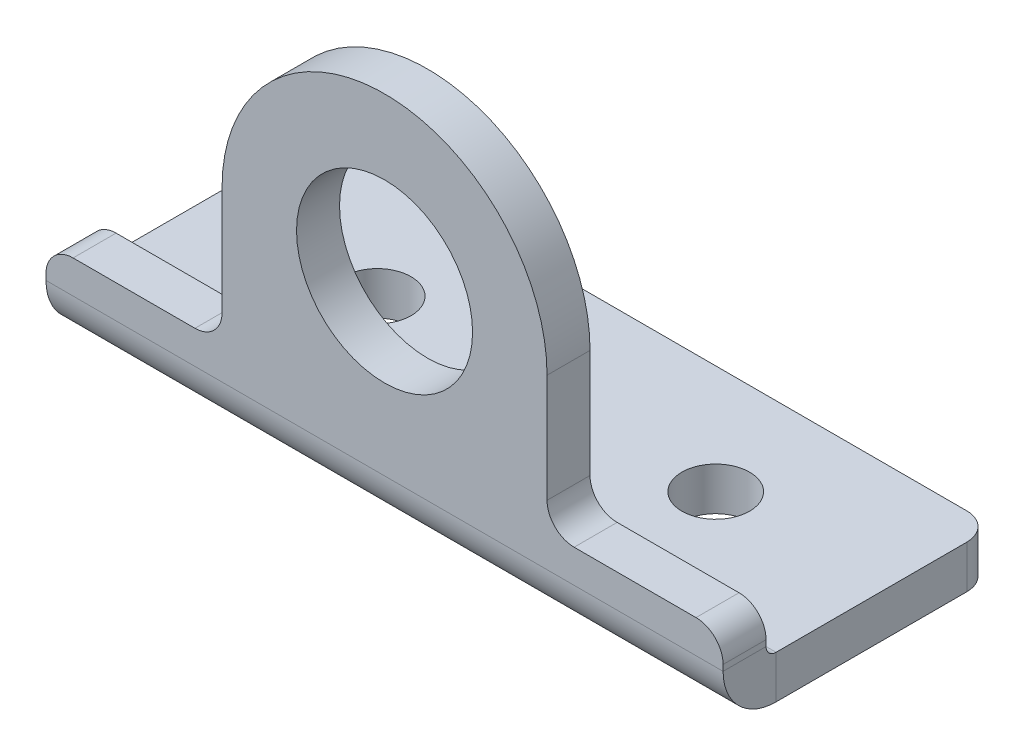
ISO-10303-21;
HEADER;
FILE_DESCRIPTION(('STEP AP214'),'2;1');
FILE_NAME('part.step','',(''),(''),'','','');
FILE_SCHEMA(('AUTOMOTIVE_DESIGN { 1 0 10303 214 1 1 1 1 }'));
ENDSEC;
DATA;
#1=APPLICATION_CONTEXT('core data for automotive mechanical design processes');
#2=APPLICATION_PROTOCOL_DEFINITION('international standard','automotive_design',2000,#1);
#3=PRODUCT_CONTEXT('',#1,'mechanical');
#4=PRODUCT('Part','Part','',(#3));
#5=PRODUCT_RELATED_PRODUCT_CATEGORY('part','',(#4));
#6=PRODUCT_DEFINITION_FORMATION('','',#4);
#7=PRODUCT_DEFINITION_CONTEXT('part definition',#1,'design');
#8=PRODUCT_DEFINITION('design','',#6,#7);
#9=PRODUCT_DEFINITION_SHAPE('','',#8);
#10=(LENGTH_UNIT() NAMED_UNIT(*) SI_UNIT(.MILLI.,.METRE.));
#11=(NAMED_UNIT(*) PLANE_ANGLE_UNIT() SI_UNIT($,.RADIAN.));
#12=(NAMED_UNIT(*) SI_UNIT($,.STERADIAN.) SOLID_ANGLE_UNIT());
#13=UNCERTAINTY_MEASURE_WITH_UNIT(LENGTH_MEASURE(1.E-05),#10,'distance_accuracy_value','');
#14=(GEOMETRIC_REPRESENTATION_CONTEXT(3) GLOBAL_UNCERTAINTY_ASSIGNED_CONTEXT((#13)) GLOBAL_UNIT_ASSIGNED_CONTEXT((#10,
#11,#12)) REPRESENTATION_CONTEXT('',''));
#15=CARTESIAN_POINT('',(0.,0.,0.));
#16=DIRECTION('',(0.,0.,1.));
#17=DIRECTION('',(1.,0.,0.));
#18=AXIS2_PLACEMENT_3D('',#15,#16,#17);
#19=CARTESIAN_POINT('',(-25.,1.17499999999999,-3.175));
#20=DIRECTION('',(-1.,0.,0.));
#21=DIRECTION('',(0.,0.,1.));
#22=AXIS2_PLACEMENT_3D('',#19,#20,#21);
#23=PLANE('',#22);
#24=DIRECTION('',(0.,-1.,0.));
#25=VECTOR('',#24,1.);
#26=CARTESIAN_POINT('',(-25.,1.17499999999999,-3.175));
#27=LINE('',#26,#25);
#28=CARTESIAN_POINT('',(-25.,1.17499999999999,-3.175));
#29=VERTEX_POINT('',#28);
#30=CARTESIAN_POINT('',(-25.,0.736599999999997,-3.175));
#31=VERTEX_POINT('',#30);
#32=EDGE_CURVE('E268',#29,#31,#27,.T.);
#33=ORIENTED_EDGE('',*,*,#32,.T.);
#34=DIRECTION('',(0.,0.,1.));
#35=VECTOR('',#34,1.);
#36=CARTESIAN_POINT('',(-25.,0.736599999999997,-3.175));
#37=LINE('',#36,#35);
#38=CARTESIAN_POINT('',(-25.,0.736599999999993,0.));
#39=VERTEX_POINT('',#38);
#40=EDGE_CURVE('E220',#31,#39,#37,.T.);
#41=ORIENTED_EDGE('',*,*,#40,.T.);
#42=DIRECTION('',(0.,-1.,0.));
#43=VECTOR('',#42,1.);
#44=CARTESIAN_POINT('',(-25.,1.17499999999999,0.));
#45=LINE('',#44,#43);
#46=CARTESIAN_POINT('',(-25.,1.17499999999999,0.));
#47=VERTEX_POINT('',#46);
#48=EDGE_CURVE('E241',#47,#39,#45,.T.);
#49=ORIENTED_EDGE('',*,*,#48,.F.);
#50=DIRECTION('',(0.,0.,1.));
#51=VECTOR('',#50,1.);
#52=CARTESIAN_POINT('',(-25.,1.17499999999999,-3.175));
#53=LINE('',#52,#51);
#54=EDGE_CURVE('E302',#29,#47,#53,.T.);
#55=ORIENTED_EDGE('',*,*,#54,.F.);
#56=EDGE_LOOP('',(#33,#41,#49,#55));
#57=FACE_BOUND('',#56,.T.);
#58=ADVANCED_FACE('F50',(#57),#23,.T.);
#59=CARTESIAN_POINT('',(23.,1.17500000000001,-3.175));
#60=DIRECTION('',(0.,0.,1.));
#61=DIRECTION('',(1.,0.,0.));
#62=AXIS2_PLACEMENT_3D('',#59,#60,#61);
#63=PLANE('',#62);
#64=CARTESIAN_POINT('',(0.,13.175,-3.175));
#65=DIRECTION('',(0.,0.,1.));
#66=DIRECTION('',(1.,0.,0.));
#67=AXIS2_PLACEMENT_3D('',#64,#65,#66);
#68=CIRCLE('',#67,6.5);
#69=CARTESIAN_POINT('',(6.50000000000001,13.175,-3.175));
#70=VERTEX_POINT('',#69);
#71=EDGE_CURVE('E232',#70,#70,#68,.T.);
#72=ORIENTED_EDGE('',*,*,#71,.T.);
#73=EDGE_LOOP('',(#72));
#74=FACE_BOUND('',#73,.T.);
#75=DIRECTION('',(-1.,0.,0.));
#76=VECTOR('',#75,1.);
#77=CARTESIAN_POINT('',(-25.,0.736599999999997,-3.175));
#78=LINE('',#77,#76);
#79=CARTESIAN_POINT('',(25.,0.736600000000005,-3.175));
#80=VERTEX_POINT('',#79);
#81=EDGE_CURVE('E224',#31,#80,#78,.F.);
#82=ORIENTED_EDGE('',*,*,#81,.F.);
#83=ORIENTED_EDGE('',*,*,#32,.F.);
#84=CARTESIAN_POINT('',(-23.,1.175,-3.175));
#85=DIRECTION('',(0.,0.,1.));
#86=DIRECTION('',(1.,0.,0.));
#87=AXIS2_PLACEMENT_3D('',#84,#85,#86);
#88=CIRCLE('',#87,2.);
#89=CARTESIAN_POINT('',(-23.,3.175,-3.175));
#90=VERTEX_POINT('',#89);
#91=EDGE_CURVE('E265',#90,#29,#88,.T.);
#92=ORIENTED_EDGE('',*,*,#91,.F.);
#93=DIRECTION('',(-1.,0.,0.));
#94=VECTOR('',#93,1.);
#95=CARTESIAN_POINT('',(-14.,3.175,-3.175));
#96=LINE('',#95,#94);
#97=CARTESIAN_POINT('',(-14.,3.175,-3.175));
#98=VERTEX_POINT('',#97);
#99=EDGE_CURVE('E262',#98,#90,#96,.T.);
#100=ORIENTED_EDGE('',*,*,#99,.F.);
#101=CARTESIAN_POINT('',(-14.,5.175,-3.175));
#102=DIRECTION('',(0.,0.,-1.));
#103=DIRECTION('',(-1.,0.,0.));
#104=AXIS2_PLACEMENT_3D('',#101,#102,#103);
#105=CIRCLE('',#104,2.);
#106=CARTESIAN_POINT('',(-12.,5.17500000000002,-3.175));
#107=VERTEX_POINT('',#106);
#108=EDGE_CURVE('E259',#107,#98,#105,.T.);
#109=ORIENTED_EDGE('',*,*,#108,.F.);
#110=DIRECTION('',(0.,-1.,0.));
#111=VECTOR('',#110,1.);
#112=CARTESIAN_POINT('',(-12.,13.175,-3.175));
#113=LINE('',#112,#111);
#114=CARTESIAN_POINT('',(-12.,13.175,-3.175));
#115=VERTEX_POINT('',#114);
#116=EDGE_CURVE('E256',#115,#107,#113,.T.);
#117=ORIENTED_EDGE('',*,*,#116,.F.);
#118=CARTESIAN_POINT('',(0.,13.175,-3.175));
#119=DIRECTION('',(0.,0.,1.));
#120=DIRECTION('',(1.,0.,0.));
#121=AXIS2_PLACEMENT_3D('',#118,#119,#120);
#122=CIRCLE('',#121,12.);
#123=CARTESIAN_POINT('',(12.,13.175,-3.175));
#124=VERTEX_POINT('',#123);
#125=EDGE_CURVE('E253',#124,#115,#122,.T.);
#126=ORIENTED_EDGE('',*,*,#125,.F.);
#127=DIRECTION('',(0.,1.,0.));
#128=VECTOR('',#127,1.);
#129=CARTESIAN_POINT('',(12.,5.17500000000002,-3.175));
#130=LINE('',#129,#128);
#131=CARTESIAN_POINT('',(12.,5.17500000000002,-3.175));
#132=VERTEX_POINT('',#131);
#133=EDGE_CURVE('E250',#132,#124,#130,.T.);
#134=ORIENTED_EDGE('',*,*,#133,.F.);
#135=CARTESIAN_POINT('',(14.,5.17500000000001,-3.175));
#136=DIRECTION('',(0.,0.,-1.));
#137=DIRECTION('',(-1.,0.,0.));
#138=AXIS2_PLACEMENT_3D('',#135,#136,#137);
#139=CIRCLE('',#138,2.);
#140=CARTESIAN_POINT('',(14.,3.17500000000001,-3.175));
#141=VERTEX_POINT('',#140);
#142=EDGE_CURVE('E247',#141,#132,#139,.T.);
#143=ORIENTED_EDGE('',*,*,#142,.F.);
#144=DIRECTION('',(-1.,0.,0.));
#145=VECTOR('',#144,1.);
#146=CARTESIAN_POINT('',(23.,3.17500000000001,-3.175));
#147=LINE('',#146,#145);
#148=CARTESIAN_POINT('',(23.,3.17500000000001,-3.175));
#149=VERTEX_POINT('',#148);
#150=EDGE_CURVE('E244',#149,#141,#147,.T.);
#151=ORIENTED_EDGE('',*,*,#150,.F.);
#152=CARTESIAN_POINT('',(23.,1.17500000000001,-3.175));
#153=DIRECTION('',(0.,0.,1.));
#154=DIRECTION('',(1.,0.,0.));
#155=AXIS2_PLACEMENT_3D('',#152,#153,#154);
#156=CIRCLE('',#155,2.);
#157=CARTESIAN_POINT('',(25.,1.17499999999999,-3.175));
#158=VERTEX_POINT('',#157);
#159=EDGE_CURVE('E240',#158,#149,#156,.T.);
#160=ORIENTED_EDGE('',*,*,#159,.F.);
#161=DIRECTION('',(0.,1.,0.));
#162=VECTOR('',#161,1.);
#163=CARTESIAN_POINT('',(25.,0.,-3.175));
#164=LINE('',#163,#162);
#165=EDGE_CURVE('E238',#80,#158,#164,.T.);
#166=ORIENTED_EDGE('',*,*,#165,.F.);
#167=EDGE_LOOP('',(#82,#83,#92,#100,#109,#117,#126,#134,#143,#151,#160,#166));
#168=FACE_BOUND('',#167,.T.);
#169=ADVANCED_FACE('F387',(#74,#168),#63,.F.);
#170=CARTESIAN_POINT('',(23.,1.17500000000001,0.));
#171=DIRECTION('',(0.,0.,1.));
#172=DIRECTION('',(1.,0.,0.));
#173=AXIS2_PLACEMENT_3D('',#170,#171,#172);
#174=PLANE('',#173);
#175=CARTESIAN_POINT('',(0.,13.175,0.));
#176=DIRECTION('',(0.,0.,1.));
#177=DIRECTION('',(1.,0.,0.));
#178=AXIS2_PLACEMENT_3D('',#175,#176,#177);
#179=CIRCLE('',#178,6.5);
#180=CARTESIAN_POINT('',(6.50000000000001,13.175,0.));
#181=VERTEX_POINT('',#180);
#182=EDGE_CURVE('E230',#181,#181,#179,.T.);
#183=ORIENTED_EDGE('',*,*,#182,.F.);
#184=EDGE_LOOP('',(#183));
#185=FACE_BOUND('',#184,.T.);
#186=ORIENTED_EDGE('',*,*,#48,.T.);
#187=DIRECTION('',(-1.,0.,0.));
#188=VECTOR('',#187,1.);
#189=CARTESIAN_POINT('',(-25.,0.736599999999993,0.));
#190=LINE('',#189,#188);
#191=CARTESIAN_POINT('',(25.,0.736600000000005,0.));
#192=VERTEX_POINT('',#191);
#193=EDGE_CURVE('E184',#39,#192,#190,.F.);
#194=ORIENTED_EDGE('',*,*,#193,.T.);
#195=DIRECTION('',(0.,1.,0.));
#196=VECTOR('',#195,1.);
#197=CARTESIAN_POINT('',(25.,0.,0.));
#198=LINE('',#197,#196);
#199=CARTESIAN_POINT('',(25.,1.17499999999999,0.));
#200=VERTEX_POINT('',#199);
#201=EDGE_CURVE('E235',#192,#200,#198,.T.);
#202=ORIENTED_EDGE('',*,*,#201,.T.);
#203=CARTESIAN_POINT('',(23.,1.17500000000001,0.));
#204=DIRECTION('',(0.,0.,1.));
#205=DIRECTION('',(1.,0.,0.));
#206=AXIS2_PLACEMENT_3D('',#203,#204,#205);
#207=CIRCLE('',#206,2.);
#208=CARTESIAN_POINT('',(23.,3.17500000000001,0.));
#209=VERTEX_POINT('',#208);
#210=EDGE_CURVE('E273',#200,#209,#207,.T.);
#211=ORIENTED_EDGE('',*,*,#210,.T.);
#212=DIRECTION('',(-1.,0.,0.));
#213=VECTOR('',#212,1.);
#214=CARTESIAN_POINT('',(23.,3.17500000000001,0.));
#215=LINE('',#214,#213);
#216=CARTESIAN_POINT('',(14.,3.17500000000001,0.));
#217=VERTEX_POINT('',#216);
#218=EDGE_CURVE('E276',#209,#217,#215,.T.);
#219=ORIENTED_EDGE('',*,*,#218,.T.);
#220=CARTESIAN_POINT('',(14.,5.17500000000001,0.));
#221=DIRECTION('',(0.,0.,-1.));
#222=DIRECTION('',(-1.,0.,0.));
#223=AXIS2_PLACEMENT_3D('',#220,#221,#222);
#224=CIRCLE('',#223,2.);
#225=CARTESIAN_POINT('',(12.,5.17500000000002,0.));
#226=VERTEX_POINT('',#225);
#227=EDGE_CURVE('E279',#217,#226,#224,.T.);
#228=ORIENTED_EDGE('',*,*,#227,.T.);
#229=DIRECTION('',(0.,1.,0.));
#230=VECTOR('',#229,1.);
#231=CARTESIAN_POINT('',(12.,5.17500000000002,0.));
#232=LINE('',#231,#230);
#233=CARTESIAN_POINT('',(12.,13.175,0.));
#234=VERTEX_POINT('',#233);
#235=EDGE_CURVE('E282',#226,#234,#232,.T.);
#236=ORIENTED_EDGE('',*,*,#235,.T.);
#237=CARTESIAN_POINT('',(0.,13.175,0.));
#238=DIRECTION('',(0.,0.,1.));
#239=DIRECTION('',(1.,0.,0.));
#240=AXIS2_PLACEMENT_3D('',#237,#238,#239);
#241=CIRCLE('',#240,12.);
#242=CARTESIAN_POINT('',(-12.,13.175,0.));
#243=VERTEX_POINT('',#242);
#244=EDGE_CURVE('E285',#234,#243,#241,.T.);
#245=ORIENTED_EDGE('',*,*,#244,.T.);
#246=DIRECTION('',(0.,-1.,0.));
#247=VECTOR('',#246,1.);
#248=CARTESIAN_POINT('',(-12.,13.175,0.));
#249=LINE('',#248,#247);
#250=CARTESIAN_POINT('',(-12.,5.17500000000002,0.));
#251=VERTEX_POINT('',#250);
#252=EDGE_CURVE('E288',#243,#251,#249,.T.);
#253=ORIENTED_EDGE('',*,*,#252,.T.);
#254=CARTESIAN_POINT('',(-14.,5.175,0.));
#255=DIRECTION('',(0.,0.,-1.));
#256=DIRECTION('',(-1.,0.,0.));
#257=AXIS2_PLACEMENT_3D('',#254,#255,#256);
#258=CIRCLE('',#257,2.);
#259=CARTESIAN_POINT('',(-14.,3.175,0.));
#260=VERTEX_POINT('',#259);
#261=EDGE_CURVE('E291',#251,#260,#258,.T.);
#262=ORIENTED_EDGE('',*,*,#261,.T.);
#263=DIRECTION('',(-1.,0.,0.));
#264=VECTOR('',#263,1.);
#265=CARTESIAN_POINT('',(-14.,3.175,0.));
#266=LINE('',#265,#264);
#267=CARTESIAN_POINT('',(-23.,3.175,0.));
#268=VERTEX_POINT('',#267);
#269=EDGE_CURVE('E294',#260,#268,#266,.T.);
#270=ORIENTED_EDGE('',*,*,#269,.T.);
#271=CARTESIAN_POINT('',(-23.,1.175,0.));
#272=DIRECTION('',(0.,0.,1.));
#273=DIRECTION('',(1.,0.,0.));
#274=AXIS2_PLACEMENT_3D('',#271,#272,#273);
#275=CIRCLE('',#274,2.);
#276=EDGE_CURVE('E297',#268,#47,#275,.T.);
#277=ORIENTED_EDGE('',*,*,#276,.T.);
#278=EDGE_LOOP('',(#186,#194,#202,#211,#219,#228,#236,#245,#253,#262,#270,#277));
#279=FACE_BOUND('',#278,.T.);
#280=ADVANCED_FACE('F394',(#185,#279),#174,.T.);
#281=CARTESIAN_POINT('',(25.,0.,-3.175));
#282=DIRECTION('',(1.,0.,0.));
#283=DIRECTION('',(0.,0.,-1.));
#284=AXIS2_PLACEMENT_3D('',#281,#282,#283);
#285=PLANE('',#284);
#286=DIRECTION('',(0.,0.,1.));
#287=VECTOR('',#286,1.);
#288=CARTESIAN_POINT('',(25.,0.736600000000005,-3.175));
#289=LINE('',#288,#287);
#290=EDGE_CURVE('E227',#80,#192,#289,.T.);
#291=ORIENTED_EDGE('',*,*,#290,.F.);
#292=ORIENTED_EDGE('',*,*,#165,.T.);
#293=DIRECTION('',(0.,0.,1.));
#294=VECTOR('',#293,1.);
#295=CARTESIAN_POINT('',(25.,1.17499999999999,-3.175));
#296=LINE('',#295,#294);
#297=EDGE_CURVE('E271',#158,#200,#296,.T.);
#298=ORIENTED_EDGE('',*,*,#297,.T.);
#299=ORIENTED_EDGE('',*,*,#201,.F.);
#300=EDGE_LOOP('',(#291,#292,#298,#299));
#301=FACE_BOUND('',#300,.T.);
#302=ADVANCED_FACE('F403',(#301),#285,.T.);
#303=CARTESIAN_POINT('',(-23.,1.175,-3.175));
#304=DIRECTION('',(0.,0.,1.));
#305=DIRECTION('',(1.,0.,0.));
#306=AXIS2_PLACEMENT_3D('',#303,#304,#305);
#307=CYLINDRICAL_SURFACE('',#306,2.);
#308=ORIENTED_EDGE('',*,*,#276,.F.);
#309=DIRECTION('',(0.,0.,1.));
#310=VECTOR('',#309,1.);
#311=CARTESIAN_POINT('',(-23.,3.175,-3.175));
#312=LINE('',#311,#310);
#313=EDGE_CURVE('E305',#90,#268,#312,.T.);
#314=ORIENTED_EDGE('',*,*,#313,.F.);
#315=ORIENTED_EDGE('',*,*,#91,.T.);
#316=ORIENTED_EDGE('',*,*,#54,.T.);
#317=EDGE_LOOP('',(#308,#314,#315,#316));
#318=FACE_BOUND('',#317,.T.);
#319=ADVANCED_FACE('F399',(#318),#307,.T.);
#320=CARTESIAN_POINT('',(-14.,3.175,-3.175));
#321=DIRECTION('',(0.,1.,0.));
#322=DIRECTION('',(-1.,0.,0.));
#323=AXIS2_PLACEMENT_3D('',#320,#321,#322);
#324=PLANE('',#323);
#325=ORIENTED_EDGE('',*,*,#269,.F.);
#326=DIRECTION('',(0.,0.,1.));
#327=VECTOR('',#326,1.);
#328=CARTESIAN_POINT('',(-14.,3.175,-3.175));
#329=LINE('',#328,#327);
#330=EDGE_CURVE('E307',#98,#260,#329,.T.);
#331=ORIENTED_EDGE('',*,*,#330,.F.);
#332=ORIENTED_EDGE('',*,*,#99,.T.);
#333=ORIENTED_EDGE('',*,*,#313,.T.);
#334=EDGE_LOOP('',(#325,#331,#332,#333));
#335=FACE_BOUND('',#334,.T.);
#336=ADVANCED_FACE('F402',(#335),#324,.T.);
#337=CARTESIAN_POINT('',(-14.,5.175,-3.175));
#338=DIRECTION('',(0.,0.,1.));
#339=DIRECTION('',(1.,0.,0.));
#340=AXIS2_PLACEMENT_3D('',#337,#338,#339);
#341=CYLINDRICAL_SURFACE('',#340,2.);
#342=ORIENTED_EDGE('',*,*,#261,.F.);
#343=DIRECTION('',(0.,0.,1.));
#344=VECTOR('',#343,1.);
#345=CARTESIAN_POINT('',(-12.,5.17500000000002,-3.175));
#346=LINE('',#345,#344);
#347=EDGE_CURVE('E309',#107,#251,#346,.T.);
#348=ORIENTED_EDGE('',*,*,#347,.F.);
#349=ORIENTED_EDGE('',*,*,#108,.T.);
#350=ORIENTED_EDGE('',*,*,#330,.T.);
#351=EDGE_LOOP('',(#342,#348,#349,#350));
#352=FACE_BOUND('',#351,.T.);
#353=ADVANCED_FACE('F407',(#352),#341,.F.);
#354=CARTESIAN_POINT('',(-12.,13.175,-3.175));
#355=DIRECTION('',(-1.,0.,0.));
#356=DIRECTION('',(0.,-1.,0.));
#357=AXIS2_PLACEMENT_3D('',#354,#355,#356);
#358=PLANE('',#357);
#359=ORIENTED_EDGE('',*,*,#252,.F.);
#360=DIRECTION('',(0.,0.,1.));
#361=VECTOR('',#360,1.);
#362=CARTESIAN_POINT('',(-12.,13.175,-3.175));
#363=LINE('',#362,#361);
#364=EDGE_CURVE('E311',#115,#243,#363,.T.);
#365=ORIENTED_EDGE('',*,*,#364,.F.);
#366=ORIENTED_EDGE('',*,*,#116,.T.);
#367=ORIENTED_EDGE('',*,*,#347,.T.);
#368=EDGE_LOOP('',(#359,#365,#366,#367));
#369=FACE_BOUND('',#368,.T.);
#370=ADVANCED_FACE('F411',(#369),#358,.T.);
#371=CARTESIAN_POINT('',(0.,13.175,-3.175));
#372=DIRECTION('',(0.,0.,1.));
#373=DIRECTION('',(1.,0.,0.));
#374=AXIS2_PLACEMENT_3D('',#371,#372,#373);
#375=CYLINDRICAL_SURFACE('',#374,12.);
#376=ORIENTED_EDGE('',*,*,#244,.F.);
#377=DIRECTION('',(0.,0.,1.));
#378=VECTOR('',#377,1.);
#379=CARTESIAN_POINT('',(12.,13.175,-3.175));
#380=LINE('',#379,#378);
#381=EDGE_CURVE('E313',#124,#234,#380,.T.);
#382=ORIENTED_EDGE('',*,*,#381,.F.);
#383=ORIENTED_EDGE('',*,*,#125,.T.);
#384=ORIENTED_EDGE('',*,*,#364,.T.);
#385=EDGE_LOOP('',(#376,#382,#383,#384));
#386=FACE_BOUND('',#385,.T.);
#387=ADVANCED_FACE('F415',(#386),#375,.T.);
#388=CARTESIAN_POINT('',(12.,5.17500000000002,-3.175));
#389=DIRECTION('',(1.,0.,0.));
#390=DIRECTION('',(0.,1.,0.));
#391=AXIS2_PLACEMENT_3D('',#388,#389,#390);
#392=PLANE('',#391);
#393=ORIENTED_EDGE('',*,*,#235,.F.);
#394=DIRECTION('',(0.,0.,1.));
#395=VECTOR('',#394,1.);
#396=CARTESIAN_POINT('',(12.,5.17500000000002,-3.175));
#397=LINE('',#396,#395);
#398=EDGE_CURVE('E315',#132,#226,#397,.T.);
#399=ORIENTED_EDGE('',*,*,#398,.F.);
#400=ORIENTED_EDGE('',*,*,#133,.T.);
#401=ORIENTED_EDGE('',*,*,#381,.T.);
#402=EDGE_LOOP('',(#393,#399,#400,#401));
#403=FACE_BOUND('',#402,.T.);
#404=ADVANCED_FACE('F419',(#403),#392,.T.);
#405=CARTESIAN_POINT('',(14.,5.17500000000001,-3.175));
#406=DIRECTION('',(0.,0.,1.));
#407=DIRECTION('',(1.,0.,0.));
#408=AXIS2_PLACEMENT_3D('',#405,#406,#407);
#409=CYLINDRICAL_SURFACE('',#408,2.);
#410=ORIENTED_EDGE('',*,*,#227,.F.);
#411=DIRECTION('',(0.,0.,1.));
#412=VECTOR('',#411,1.);
#413=CARTESIAN_POINT('',(14.,3.17500000000001,-3.175));
#414=LINE('',#413,#412);
#415=EDGE_CURVE('E317',#141,#217,#414,.T.);
#416=ORIENTED_EDGE('',*,*,#415,.F.);
#417=ORIENTED_EDGE('',*,*,#142,.T.);
#418=ORIENTED_EDGE('',*,*,#398,.T.);
#419=EDGE_LOOP('',(#410,#416,#417,#418));
#420=FACE_BOUND('',#419,.T.);
#421=ADVANCED_FACE('F423',(#420),#409,.F.);
#422=CARTESIAN_POINT('',(23.,3.17500000000001,-3.175));
#423=DIRECTION('',(0.,1.,0.));
#424=DIRECTION('',(-1.,0.,0.));
#425=AXIS2_PLACEMENT_3D('',#422,#423,#424);
#426=PLANE('',#425);
#427=ORIENTED_EDGE('',*,*,#218,.F.);
#428=DIRECTION('',(0.,0.,1.));
#429=VECTOR('',#428,1.);
#430=CARTESIAN_POINT('',(23.,3.17500000000001,-3.175));
#431=LINE('',#430,#429);
#432=EDGE_CURVE('E319',#149,#209,#431,.T.);
#433=ORIENTED_EDGE('',*,*,#432,.F.);
#434=ORIENTED_EDGE('',*,*,#150,.T.);
#435=ORIENTED_EDGE('',*,*,#415,.T.);
#436=EDGE_LOOP('',(#427,#433,#434,#435));
#437=FACE_BOUND('',#436,.T.);
#438=ADVANCED_FACE('F427',(#437),#426,.T.);
#439=CARTESIAN_POINT('',(23.,1.17500000000001,-3.175));
#440=DIRECTION('',(0.,0.,1.));
#441=DIRECTION('',(1.,0.,0.));
#442=AXIS2_PLACEMENT_3D('',#439,#440,#441);
#443=CYLINDRICAL_SURFACE('',#442,2.);
#444=ORIENTED_EDGE('',*,*,#210,.F.);
#445=ORIENTED_EDGE('',*,*,#297,.F.);
#446=ORIENTED_EDGE('',*,*,#159,.T.);
#447=ORIENTED_EDGE('',*,*,#432,.T.);
#448=EDGE_LOOP('',(#444,#445,#446,#447));
#449=FACE_BOUND('',#448,.T.);
#450=ADVANCED_FACE('F431',(#449),#443,.T.);
#451=CARTESIAN_POINT('',(0.,13.175,-3.175));
#452=DIRECTION('',(0.,0.,1.));
#453=DIRECTION('',(1.,0.,0.));
#454=AXIS2_PLACEMENT_3D('',#451,#452,#453);
#455=CYLINDRICAL_SURFACE('',#454,6.5);
#456=ORIENTED_EDGE('',*,*,#71,.F.);
#457=EDGE_LOOP('',(#456));
#458=FACE_BOUND('',#457,.T.);
#459=ORIENTED_EDGE('',*,*,#182,.T.);
#460=EDGE_LOOP('',(#459));
#461=FACE_BOUND('',#460,.T.);
#462=ADVANCED_FACE('F435',(#458,#461),#455,.F.);
#463=CARTESIAN_POINT('',(25.,0.736600000000005,-3.9116));
#464=DIRECTION('',(1.,0.,0.));
#465=DIRECTION('',(0.,1.,0.));
#466=AXIS2_PLACEMENT_3D('',#463,#464,#465);
#467=PLANE('',#466);
#468=DIRECTION('',(0.,-1.,0.));
#469=VECTOR('',#468,1.);
#470=CARTESIAN_POINT('',(25.,0.,-3.9116));
#471=LINE('',#470,#469);
#472=CARTESIAN_POINT('',(25.,0.,-3.9116));
#473=VERTEX_POINT('',#472);
#474=CARTESIAN_POINT('',(25.,-3.17499999999999,-3.91159999999999));
#475=VERTEX_POINT('',#474);
#476=EDGE_CURVE('E342',#473,#475,#471,.T.);
#477=ORIENTED_EDGE('',*,*,#476,.F.);
#478=CARTESIAN_POINT('',(25.,0.736600000000005,-3.9116));
#479=DIRECTION('',(-1.,0.,0.));
#480=DIRECTION('',(0.,-1.,0.));
#481=AXIS2_PLACEMENT_3D('',#478,#479,#480);
#482=CIRCLE('',#481,0.736599999999999);
#483=EDGE_CURVE('E187',#80,#473,#482,.F.);
#484=ORIENTED_EDGE('',*,*,#483,.F.);
#485=ORIENTED_EDGE('',*,*,#290,.T.);
#486=CARTESIAN_POINT('',(25.,0.736600000000005,-3.9116));
#487=DIRECTION('',(-1.,0.,0.));
#488=DIRECTION('',(0.,-1.,0.));
#489=AXIS2_PLACEMENT_3D('',#486,#487,#488);
#490=CIRCLE('',#489,3.9116);
#491=EDGE_CURVE('E219',#192,#475,#490,.F.);
#492=ORIENTED_EDGE('',*,*,#491,.T.);
#493=EDGE_LOOP('',(#477,#484,#485,#492));
#494=FACE_BOUND('',#493,.T.);
#495=ADVANCED_FACE('F456',(#494),#467,.T.);
#496=CARTESIAN_POINT('',(-25.,0.736599999999998,-3.9116));
#497=DIRECTION('',(1.,0.,0.));
#498=DIRECTION('',(0.,1.,0.));
#499=AXIS2_PLACEMENT_3D('',#496,#497,#498);
#500=PLANE('',#499);
#501=CARTESIAN_POINT('',(-25.,0.736599999999998,-3.9116));
#502=DIRECTION('',(-1.,0.,0.));
#503=DIRECTION('',(0.,-1.,0.));
#504=AXIS2_PLACEMENT_3D('',#501,#502,#503);
#505=CIRCLE('',#504,0.736599999999999);
#506=CARTESIAN_POINT('',(-25.,0.,-3.9116));
#507=VERTEX_POINT('',#506);
#508=EDGE_CURVE('E194',#507,#31,#505,.T.);
#509=ORIENTED_EDGE('',*,*,#508,.F.);
#510=DIRECTION('',(0.,-1.,0.));
#511=VECTOR('',#510,1.);
#512=CARTESIAN_POINT('',(-25.,0.,-3.9116));
#513=LINE('',#512,#511);
#514=CARTESIAN_POINT('',(-25.,-3.175,-3.91159999999999));
#515=VERTEX_POINT('',#514);
#516=EDGE_CURVE('E191',#507,#515,#513,.T.);
#517=ORIENTED_EDGE('',*,*,#516,.T.);
#518=CARTESIAN_POINT('',(-25.,0.736599999999998,-3.9116));
#519=DIRECTION('',(-1.,0.,0.));
#520=DIRECTION('',(0.,-1.,0.));
#521=AXIS2_PLACEMENT_3D('',#518,#519,#520);
#522=CIRCLE('',#521,3.9116);
#523=EDGE_CURVE('E177',#515,#39,#522,.T.);
#524=ORIENTED_EDGE('',*,*,#523,.T.);
#525=ORIENTED_EDGE('',*,*,#40,.F.);
#526=EDGE_LOOP('',(#509,#517,#524,#525));
#527=FACE_BOUND('',#526,.T.);
#528=ADVANCED_FACE('F192',(#527),#500,.F.);
#529=CARTESIAN_POINT('',(-25.,0.736599999999998,-3.9116));
#530=DIRECTION('',(-1.,0.,0.));
#531=DIRECTION('',(0.,-1.,0.));
#532=AXIS2_PLACEMENT_3D('',#529,#530,#531);
#533=CYLINDRICAL_SURFACE('',#532,3.9116);
#534=ORIENTED_EDGE('',*,*,#193,.F.);
#535=ORIENTED_EDGE('',*,*,#523,.F.);
#536=DIRECTION('',(1.,0.,0.));
#537=VECTOR('',#536,1.);
#538=CARTESIAN_POINT('',(0.,-3.175,-3.91159999999999));
#539=LINE('',#538,#537);
#540=EDGE_CURVE('E181',#515,#475,#539,.T.);
#541=ORIENTED_EDGE('',*,*,#540,.T.);
#542=ORIENTED_EDGE('',*,*,#491,.F.);
#543=EDGE_LOOP('',(#534,#535,#541,#542));
#544=FACE_BOUND('',#543,.T.);
#545=ADVANCED_FACE('F179',(#544),#533,.T.);
#546=CARTESIAN_POINT('',(-25.,0.736599999999998,-3.9116));
#547=DIRECTION('',(-1.,0.,0.));
#548=DIRECTION('',(0.,-1.,0.));
#549=AXIS2_PLACEMENT_3D('',#546,#547,#548);
#550=CYLINDRICAL_SURFACE('',#549,0.736599999999999);
#551=ORIENTED_EDGE('',*,*,#81,.T.);
#552=ORIENTED_EDGE('',*,*,#483,.T.);
#553=DIRECTION('',(-1.,0.,0.));
#554=VECTOR('',#553,1.);
#555=CARTESIAN_POINT('',(25.,0.,-3.9116));
#556=LINE('',#555,#554);
#557=EDGE_CURVE('E196',#473,#507,#556,.T.);
#558=ORIENTED_EDGE('',*,*,#557,.T.);
#559=ORIENTED_EDGE('',*,*,#508,.T.);
#560=EDGE_LOOP('',(#551,#552,#558,#559));
#561=FACE_BOUND('',#560,.T.);
#562=ADVANCED_FACE('F451',(#561),#550,.F.);
#563=CARTESIAN_POINT('',(-25.,-3.17500000000006,-20.));
#564=DIRECTION('',(1.,0.,0.));
#565=DIRECTION('',(0.,1.,0.));
#566=AXIS2_PLACEMENT_3D('',#563,#564,#565);
#567=PLANE('',#566);
#568=DIRECTION('',(0.,0.,-1.));
#569=VECTOR('',#568,1.);
#570=CARTESIAN_POINT('',(-25.,0.,-20.));
#571=LINE('',#570,#569);
#572=CARTESIAN_POINT('',(-25.,0.,-18.));
#573=VERTEX_POINT('',#572);
#574=EDGE_CURVE('E204',#507,#573,#571,.T.);
#575=ORIENTED_EDGE('',*,*,#574,.T.);
#576=DIRECTION('',(0.,1.,0.));
#577=VECTOR('',#576,1.);
#578=CARTESIAN_POINT('',(-25.,-3.17500000000005,-18.));
#579=LINE('',#578,#577);
#580=CARTESIAN_POINT('',(-25.,-3.17500000000005,-18.));
#581=VERTEX_POINT('',#580);
#582=EDGE_CURVE('E11',#573,#581,#579,.F.);
#583=ORIENTED_EDGE('',*,*,#582,.T.);
#584=DIRECTION('',(0.,0.,-1.));
#585=VECTOR('',#584,1.);
#586=CARTESIAN_POINT('',(-25.,-3.17500000000006,-20.));
#587=LINE('',#586,#585);
#588=EDGE_CURVE('E200',#515,#581,#587,.T.);
#589=ORIENTED_EDGE('',*,*,#588,.F.);
#590=ORIENTED_EDGE('',*,*,#516,.F.);
#591=EDGE_LOOP('',(#575,#583,#589,#590));
#592=FACE_BOUND('',#591,.T.);
#593=ADVANCED_FACE('F206',(#592),#567,.F.);
#594=CARTESIAN_POINT('',(25.,-3.17499999999999,-3.17499999999999));
#595=DIRECTION('',(-1.,0.,0.));
#596=DIRECTION('',(0.,-1.,0.));
#597=AXIS2_PLACEMENT_3D('',#594,#595,#596);
#598=PLANE('',#597);
#599=DIRECTION('',(0.,0.,1.));
#600=VECTOR('',#599,1.);
#601=CARTESIAN_POINT('',(25.,-3.17499999999999,-3.17499999999999));
#602=LINE('',#601,#600);
#603=CARTESIAN_POINT('',(25.,-3.17500000000004,-18.));
#604=VERTEX_POINT('',#603);
#605=EDGE_CURVE('E203',#604,#475,#602,.T.);
#606=ORIENTED_EDGE('',*,*,#605,.F.);
#607=DIRECTION('',(0.,1.,0.));
#608=VECTOR('',#607,1.);
#609=CARTESIAN_POINT('',(25.,-3.17500000000004,-18.));
#610=LINE('',#609,#608);
#611=CARTESIAN_POINT('',(25.,0.,-18.));
#612=VERTEX_POINT('',#611);
#613=EDGE_CURVE('E304',#604,#612,#610,.T.);
#614=ORIENTED_EDGE('',*,*,#613,.T.);
#615=DIRECTION('',(0.,0.,1.));
#616=VECTOR('',#615,1.);
#617=CARTESIAN_POINT('',(25.,0.,-3.175));
#618=LINE('',#617,#616);
#619=EDGE_CURVE('E208',#612,#473,#618,.T.);
#620=ORIENTED_EDGE('',*,*,#619,.T.);
#621=ORIENTED_EDGE('',*,*,#476,.T.);
#622=EDGE_LOOP('',(#606,#614,#620,#621));
#623=FACE_BOUND('',#622,.T.);
#624=ADVANCED_FACE('F339',(#623),#598,.F.);
#625=CARTESIAN_POINT('',(0.,-3.17499999999998,0.));
#626=DIRECTION('',(0.,1.,0.));
#627=DIRECTION('',(0.,0.,1.));
#628=AXIS2_PLACEMENT_3D('',#625,#626,#627);
#629=PLANE('',#628);
#630=CARTESIAN_POINT('',(12.5,-3.1750000000001,-11.9558));
#631=DIRECTION('',(0.,1.,0.));
#632=DIRECTION('',(0.,0.,1.));
#633=AXIS2_PLACEMENT_3D('',#630,#631,#632);
#634=CIRCLE('',#633,2.5);
#635=CARTESIAN_POINT('',(12.5,-3.17500000000009,-9.45579999999999));
#636=VERTEX_POINT('',#635);
#637=EDGE_CURVE('E360',#636,#636,#634,.T.);
#638=ORIENTED_EDGE('',*,*,#637,.T.);
#639=EDGE_LOOP('',(#638));
#640=FACE_BOUND('',#639,.T.);
#641=CARTESIAN_POINT('',(-12.5,-3.17500000000011,-11.9558));
#642=DIRECTION('',(0.,1.,0.));
#643=DIRECTION('',(0.,0.,1.));
#644=AXIS2_PLACEMENT_3D('',#641,#642,#643);
#645=CIRCLE('',#644,2.5);
#646=CARTESIAN_POINT('',(-12.5,-3.1750000000001,-9.45579999999999));
#647=VERTEX_POINT('',#646);
#648=EDGE_CURVE('E353',#647,#647,#645,.T.);
#649=ORIENTED_EDGE('',*,*,#648,.T.);
#650=EDGE_LOOP('',(#649));
#651=FACE_BOUND('',#650,.T.);
#652=DIRECTION('',(1.,0.,0.));
#653=VECTOR('',#652,1.);
#654=CARTESIAN_POINT('',(25.,-3.17500000000005,-20.));
#655=LINE('',#654,#653);
#656=CARTESIAN_POINT('',(-23.,-3.17500000000006,-20.));
#657=VERTEX_POINT('',#656);
#658=CARTESIAN_POINT('',(23.,-3.17500000000005,-20.));
#659=VERTEX_POINT('',#658);
#660=EDGE_CURVE('E207',#657,#659,#655,.T.);
#661=ORIENTED_EDGE('',*,*,#660,.T.);
#662=CARTESIAN_POINT('',(23.,-3.17500000000004,-18.));
#663=DIRECTION('',(0.,1.,0.));
#664=DIRECTION('',(0.,0.,1.));
#665=AXIS2_PLACEMENT_3D('',#662,#663,#664);
#666=CIRCLE('',#665,2.);
#667=EDGE_CURVE('E58',#659,#604,#666,.F.);
#668=ORIENTED_EDGE('',*,*,#667,.T.);
#669=ORIENTED_EDGE('',*,*,#605,.T.);
#670=ORIENTED_EDGE('',*,*,#540,.F.);
#671=ORIENTED_EDGE('',*,*,#588,.T.);
#672=CARTESIAN_POINT('',(-23.,-3.17500000000005,-18.));
#673=DIRECTION('',(0.,1.,0.));
#674=DIRECTION('',(0.,0.,1.));
#675=AXIS2_PLACEMENT_3D('',#672,#673,#674);
#676=CIRCLE('',#675,2.);
#677=EDGE_CURVE('E333',#581,#657,#676,.F.);
#678=ORIENTED_EDGE('',*,*,#677,.T.);
#679=EDGE_LOOP('',(#661,#668,#669,#670,#671,#678));
#680=FACE_BOUND('',#679,.T.);
#681=ADVANCED_FACE('F199',(#640,#651,#680),#629,.F.);
#682=CARTESIAN_POINT('',(0.,0.,0.));
#683=DIRECTION('',(0.,1.,0.));
#684=DIRECTION('',(0.,0.,1.));
#685=AXIS2_PLACEMENT_3D('',#682,#683,#684);
#686=PLANE('',#685);
#687=CARTESIAN_POINT('',(12.5,0.,-11.9558));
#688=DIRECTION('',(0.,1.,0.));
#689=DIRECTION('',(0.,0.,1.));
#690=AXIS2_PLACEMENT_3D('',#687,#688,#689);
#691=CIRCLE('',#690,2.5);
#692=CARTESIAN_POINT('',(12.5,0.,-9.45580000000001));
#693=VERTEX_POINT('',#692);
#694=EDGE_CURVE('E363',#693,#693,#691,.T.);
#695=ORIENTED_EDGE('',*,*,#694,.F.);
#696=EDGE_LOOP('',(#695));
#697=FACE_BOUND('',#696,.T.);
#698=CARTESIAN_POINT('',(-12.5,0.,-11.9558));
#699=DIRECTION('',(0.,1.,0.));
#700=DIRECTION('',(0.,0.,1.));
#701=AXIS2_PLACEMENT_3D('',#698,#699,#700);
#702=CIRCLE('',#701,2.5);
#703=CARTESIAN_POINT('',(-12.5,0.,-9.45580000000001));
#704=VERTEX_POINT('',#703);
#705=EDGE_CURVE('E357',#704,#704,#702,.T.);
#706=ORIENTED_EDGE('',*,*,#705,.F.);
#707=EDGE_LOOP('',(#706));
#708=FACE_BOUND('',#707,.T.);
#709=ORIENTED_EDGE('',*,*,#619,.F.);
#710=CARTESIAN_POINT('',(23.,0.,-18.));
#711=DIRECTION('',(0.,1.,0.));
#712=DIRECTION('',(0.,0.,1.));
#713=AXIS2_PLACEMENT_3D('',#710,#711,#712);
#714=CIRCLE('',#713,2.);
#715=CARTESIAN_POINT('',(23.,0.,-20.));
#716=VERTEX_POINT('',#715);
#717=EDGE_CURVE('E327',#612,#716,#714,.T.);
#718=ORIENTED_EDGE('',*,*,#717,.T.);
#719=DIRECTION('',(1.,0.,0.));
#720=VECTOR('',#719,1.);
#721=CARTESIAN_POINT('',(25.,0.,-20.));
#722=LINE('',#721,#720);
#723=CARTESIAN_POINT('',(-23.,0.,-20.));
#724=VERTEX_POINT('',#723);
#725=EDGE_CURVE('E211',#724,#716,#722,.T.);
#726=ORIENTED_EDGE('',*,*,#725,.F.);
#727=CARTESIAN_POINT('',(-23.,0.,-18.));
#728=DIRECTION('',(0.,1.,0.));
#729=DIRECTION('',(0.,0.,1.));
#730=AXIS2_PLACEMENT_3D('',#727,#728,#729);
#731=CIRCLE('',#730,2.);
#732=EDGE_CURVE('E325',#724,#573,#731,.T.);
#733=ORIENTED_EDGE('',*,*,#732,.T.);
#734=ORIENTED_EDGE('',*,*,#574,.F.);
#735=ORIENTED_EDGE('',*,*,#557,.F.);
#736=EDGE_LOOP('',(#709,#718,#726,#733,#734,#735));
#737=FACE_BOUND('',#736,.T.);
#738=ADVANCED_FACE('F346',(#697,#708,#737),#686,.T.);
#739=CARTESIAN_POINT('',(25.,-3.17500000000005,-20.));
#740=DIRECTION('',(0.,0.,1.));
#741=DIRECTION('',(0.,-1.,0.));
#742=AXIS2_PLACEMENT_3D('',#739,#740,#741);
#743=PLANE('',#742);
#744=ORIENTED_EDGE('',*,*,#725,.T.);
#745=DIRECTION('',(0.,1.,0.));
#746=VECTOR('',#745,1.);
#747=CARTESIAN_POINT('',(23.,-3.17500000000005,-20.));
#748=LINE('',#747,#746);
#749=EDGE_CURVE('E71',#716,#659,#748,.F.);
#750=ORIENTED_EDGE('',*,*,#749,.T.);
#751=ORIENTED_EDGE('',*,*,#660,.F.);
#752=DIRECTION('',(0.,1.,0.));
#753=VECTOR('',#752,1.);
#754=CARTESIAN_POINT('',(-23.,-3.17500000000006,-20.));
#755=LINE('',#754,#753);
#756=EDGE_CURVE('E329',#657,#724,#755,.T.);
#757=ORIENTED_EDGE('',*,*,#756,.T.);
#758=EDGE_LOOP('',(#744,#750,#751,#757));
#759=FACE_BOUND('',#758,.T.);
#760=ADVANCED_FACE('F348',(#759),#743,.F.);
#761=CARTESIAN_POINT('',(23.,-3.17500000000004,-18.));
#762=DIRECTION('',(0.,1.,0.));
#763=DIRECTION('',(0.,0.,1.));
#764=AXIS2_PLACEMENT_3D('',#761,#762,#763);
#765=CYLINDRICAL_SURFACE('',#764,2.);
#766=ORIENTED_EDGE('',*,*,#667,.F.);
#767=ORIENTED_EDGE('',*,*,#749,.F.);
#768=ORIENTED_EDGE('',*,*,#717,.F.);
#769=ORIENTED_EDGE('',*,*,#613,.F.);
#770=EDGE_LOOP('',(#766,#767,#768,#769));
#771=FACE_BOUND('',#770,.T.);
#772=ADVANCED_FACE('F343',(#771),#765,.T.);
#773=CARTESIAN_POINT('',(-23.,-3.17500000000005,-18.));
#774=DIRECTION('',(0.,1.,0.));
#775=DIRECTION('',(0.,0.,1.));
#776=AXIS2_PLACEMENT_3D('',#773,#774,#775);
#777=CYLINDRICAL_SURFACE('',#776,2.);
#778=ORIENTED_EDGE('',*,*,#677,.F.);
#779=ORIENTED_EDGE('',*,*,#582,.F.);
#780=ORIENTED_EDGE('',*,*,#732,.F.);
#781=ORIENTED_EDGE('',*,*,#756,.F.);
#782=EDGE_LOOP('',(#778,#779,#780,#781));
#783=FACE_BOUND('',#782,.T.);
#784=ADVANCED_FACE('F52',(#783),#777,.T.);
#785=CARTESIAN_POINT('',(-12.5,0.,-11.9558));
#786=DIRECTION('',(0.,1.,0.));
#787=DIRECTION('',(0.,0.,1.));
#788=AXIS2_PLACEMENT_3D('',#785,#786,#787);
#789=CYLINDRICAL_SURFACE('',#788,2.5);
#790=ORIENTED_EDGE('',*,*,#648,.F.);
#791=EDGE_LOOP('',(#790));
#792=FACE_BOUND('',#791,.T.);
#793=ORIENTED_EDGE('',*,*,#705,.T.);
#794=EDGE_LOOP('',(#793));
#795=FACE_BOUND('',#794,.T.);
#796=ADVANCED_FACE('F374',(#792,#795),#789,.F.);
#797=CARTESIAN_POINT('',(12.5,0.,-11.9558));
#798=DIRECTION('',(0.,1.,0.));
#799=DIRECTION('',(0.,0.,1.));
#800=AXIS2_PLACEMENT_3D('',#797,#798,#799);
#801=CYLINDRICAL_SURFACE('',#800,2.5);
#802=ORIENTED_EDGE('',*,*,#637,.F.);
#803=EDGE_LOOP('',(#802));
#804=FACE_BOUND('',#803,.T.);
#805=ORIENTED_EDGE('',*,*,#694,.T.);
#806=EDGE_LOOP('',(#805));
#807=FACE_BOUND('',#806,.T.);
#808=ADVANCED_FACE('F367',(#804,#807),#801,.F.);
#809=CLOSED_SHELL('',(#58,#169,#280,#302,#319,#336,#353,#370,#387,#404,#421,#438,#450,#462,#495,
#528,#545,#562,#593,#624,#681,#738,#760,#772,#784,#796,#808));
#810=MANIFOLD_SOLID_BREP('B2',#809);
#811=ADVANCED_BREP_SHAPE_REPRESENTATION('',(#18,#810),#14);
#812=SHAPE_DEFINITION_REPRESENTATION(#9,#811);
ENDSEC;
END-ISO-10303-21;
